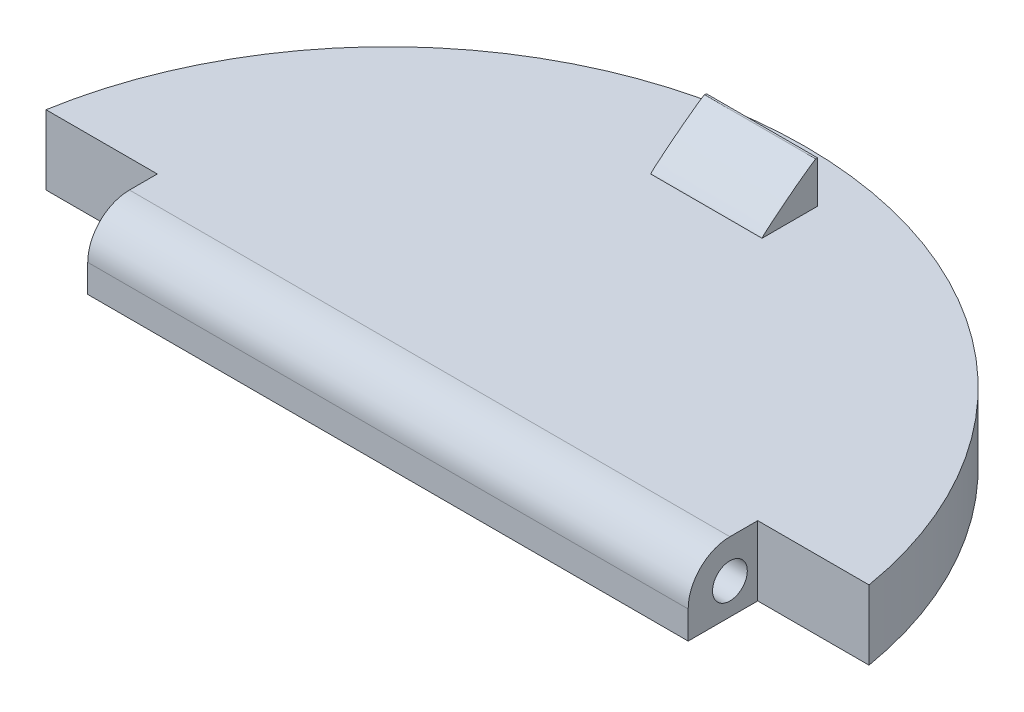
ISO-10303-21;
HEADER;
FILE_DESCRIPTION(('STEP AP214'),'2;1');
FILE_NAME('part.step','',(''),(''),'','','');
FILE_SCHEMA(('AUTOMOTIVE_DESIGN { 1 0 10303 214 1 1 1 1 }'));
ENDSEC;
DATA;
#1=APPLICATION_CONTEXT('core data for automotive mechanical design processes');
#2=APPLICATION_PROTOCOL_DEFINITION('international standard','automotive_design',2000,#1);
#3=PRODUCT_CONTEXT('',#1,'mechanical');
#4=PRODUCT('Part','Part','',(#3));
#5=PRODUCT_RELATED_PRODUCT_CATEGORY('part','',(#4));
#6=PRODUCT_DEFINITION_FORMATION('','',#4);
#7=PRODUCT_DEFINITION_CONTEXT('part definition',#1,'design');
#8=PRODUCT_DEFINITION('design','',#6,#7);
#9=PRODUCT_DEFINITION_SHAPE('','',#8);
#10=(LENGTH_UNIT() NAMED_UNIT(*) SI_UNIT(.MILLI.,.METRE.));
#11=(NAMED_UNIT(*) PLANE_ANGLE_UNIT() SI_UNIT($,.RADIAN.));
#12=(NAMED_UNIT(*) SI_UNIT($,.STERADIAN.) SOLID_ANGLE_UNIT());
#13=UNCERTAINTY_MEASURE_WITH_UNIT(LENGTH_MEASURE(1.E-05),#10,'distance_accuracy_value','');
#14=(GEOMETRIC_REPRESENTATION_CONTEXT(3) GLOBAL_UNCERTAINTY_ASSIGNED_CONTEXT((#13)) GLOBAL_UNIT_ASSIGNED_CONTEXT((#10,
#11,#12)) REPRESENTATION_CONTEXT('',''));
#15=CARTESIAN_POINT('',(0.,0.,0.));
#16=DIRECTION('',(0.,0.,1.));
#17=DIRECTION('',(1.,0.,0.));
#18=AXIS2_PLACEMENT_3D('',#15,#16,#17);
#19=CARTESIAN_POINT('',(0.,5.,0.));
#20=DIRECTION('',(0.,1.,0.));
#21=DIRECTION('',(0.,0.,1.));
#22=AXIS2_PLACEMENT_3D('',#19,#20,#21);
#23=PLANE('',#22);
#24=DIRECTION('',(0.,0.,-1.));
#25=VECTOR('',#24,1.);
#26=CARTESIAN_POINT('',(-21.5803989154981,5.,0.));
#27=LINE('',#26,#25);
#28=CARTESIAN_POINT('',(-21.5803989154981,5.,-3.));
#29=VERTEX_POINT('',#28);
#30=CARTESIAN_POINT('',(-21.5803989154981,5.,-5.));
#31=VERTEX_POINT('',#30);
#32=EDGE_CURVE('E125',#29,#31,#27,.T.);
#33=ORIENTED_EDGE('',*,*,#32,.F.);
#34=DIRECTION('',(1.,0.,0.));
#35=VECTOR('',#34,1.);
#36=CARTESIAN_POINT('',(21.5803989154981,5.,-3.));
#37=LINE('',#36,#35);
#38=CARTESIAN_POINT('',(21.5803989154981,5.,-3.));
#39=VERTEX_POINT('',#38);
#40=EDGE_CURVE('E241',#29,#39,#37,.T.);
#41=ORIENTED_EDGE('',*,*,#40,.T.);
#42=DIRECTION('',(0.,0.,1.));
#43=VECTOR('',#42,1.);
#44=CARTESIAN_POINT('',(21.5803989154981,5.,0.));
#45=LINE('',#44,#43);
#46=CARTESIAN_POINT('',(21.5803989154981,5.,-5.));
#47=VERTEX_POINT('',#46);
#48=EDGE_CURVE('E167',#47,#39,#45,.T.);
#49=ORIENTED_EDGE('',*,*,#48,.F.);
#50=DIRECTION('',(-1.,0.,0.));
#51=VECTOR('',#50,1.);
#52=CARTESIAN_POINT('',(21.5803989154981,5.,-5.));
#53=LINE('',#52,#51);
#54=CARTESIAN_POINT('',(29.5803989154981,5.,-5.));
#55=VERTEX_POINT('',#54);
#56=EDGE_CURVE('E163',#55,#47,#53,.T.);
#57=ORIENTED_EDGE('',*,*,#56,.F.);
#58=CARTESIAN_POINT('',(0.,5.,0.));
#59=DIRECTION('',(0.,1.,0.));
#60=DIRECTION('',(0.,0.,1.));
#61=AXIS2_PLACEMENT_3D('',#58,#59,#60);
#62=CIRCLE('',#61,30.);
#63=CARTESIAN_POINT('',(-29.5803989154981,5.,-5.));
#64=VERTEX_POINT('',#63);
#65=EDGE_CURVE('E153',#55,#64,#62,.T.);
#66=ORIENTED_EDGE('',*,*,#65,.T.);
#67=DIRECTION('',(-1.,0.,0.));
#68=VECTOR('',#67,1.);
#69=CARTESIAN_POINT('',(-21.5803989154981,5.,-5.));
#70=LINE('',#69,#68);
#71=EDGE_CURVE('E136',#31,#64,#70,.T.);
#72=ORIENTED_EDGE('',*,*,#71,.F.);
#73=EDGE_LOOP('',(#33,#41,#49,#57,#66,#72));
#74=FACE_BOUND('',#73,.T.);
#75=DIRECTION('',(-1.,0.,0.));
#76=VECTOR('',#75,1.);
#77=CARTESIAN_POINT('',(-3.84159331598207,5.,-26.7316665793187));
#78=LINE('',#77,#76);
#79=CARTESIAN_POINT('',(4.15840668401793,5.,-26.7316665793187));
#80=VERTEX_POINT('',#79);
#81=CARTESIAN_POINT('',(-3.84159331598207,5.,-26.7316665793187));
#82=VERTEX_POINT('',#81);
#83=EDGE_CURVE('E200',#80,#82,#78,.T.);
#84=ORIENTED_EDGE('',*,*,#83,.F.);
#85=DIRECTION('',(0.,0.,-1.));
#86=VECTOR('',#85,1.);
#87=CARTESIAN_POINT('',(4.15840668401793,5.,-26.7316665793187));
#88=LINE('',#87,#86);
#89=CARTESIAN_POINT('',(4.15840668401793,5.,-22.7316665793187));
#90=VERTEX_POINT('',#89);
#91=EDGE_CURVE('E161',#90,#80,#88,.T.);
#92=ORIENTED_EDGE('',*,*,#91,.F.);
#93=CARTESIAN_POINT('',(-4.24159331598207,5.,-22.7316665793187));
#94=CARTESIAN_POINT('',(-1.30825998264874,5.,-22.7316665793187));
#95=CARTESIAN_POINT('',(1.6250733506846,5.,-22.7316665793187));
#96=CARTESIAN_POINT('',(4.55840668401793,5.,-22.7316665793187));
#97=(BOUNDED_CURVE() B_SPLINE_CURVE(3,(#93,#94,#95,#96),.UNSPECIFIED.,.F.,
.F.) B_SPLINE_CURVE_WITH_KNOTS((4,4),(-0.00455840668401793,0.00424159331598207),
.UNSPECIFIED.) CURVE() GEOMETRIC_REPRESENTATION_ITEM() RATIONAL_B_SPLINE_CURVE((1.,1.,1.,1.)) REPRESENTATION_ITEM(''));
#98=CARTESIAN_POINT('',(-3.84159331598207,5.,-22.7316665793187));
#99=VERTEX_POINT('',#98);
#100=EDGE_CURVE('E188',#99,#90,#97,.T.);
#101=ORIENTED_EDGE('',*,*,#100,.F.);
#102=DIRECTION('',(0.,0.,1.));
#103=VECTOR('',#102,1.);
#104=CARTESIAN_POINT('',(-3.84159331598207,5.,-26.7316665793187));
#105=LINE('',#104,#103);
#106=EDGE_CURVE('E203',#82,#99,#105,.T.);
#107=ORIENTED_EDGE('',*,*,#106,.F.);
#108=EDGE_LOOP('',(#84,#92,#101,#107));
#109=FACE_BOUND('',#108,.T.);
#110=ADVANCED_FACE('F44',(#74,#109),#23,.T.);
#111=CARTESIAN_POINT('',(0.,5.,0.));
#112=DIRECTION('',(0.,-1.,0.));
#113=DIRECTION('',(0.,0.,-1.));
#114=AXIS2_PLACEMENT_3D('',#111,#112,#113);
#115=CYLINDRICAL_SURFACE('',#114,30.);
#116=CARTESIAN_POINT('',(0.,0.,0.));
#117=DIRECTION('',(0.,1.,0.));
#118=DIRECTION('',(0.,0.,1.));
#119=AXIS2_PLACEMENT_3D('',#116,#117,#118);
#120=CIRCLE('',#119,30.);
#121=CARTESIAN_POINT('',(29.5803989154981,0.,-5.));
#122=VERTEX_POINT('',#121);
#123=CARTESIAN_POINT('',(-29.5803989154981,0.,-5.));
#124=VERTEX_POINT('',#123);
#125=EDGE_CURVE('E210',#122,#124,#120,.T.);
#126=ORIENTED_EDGE('',*,*,#125,.T.);
#127=DIRECTION('',(0.,1.,0.));
#128=VECTOR('',#127,1.);
#129=CARTESIAN_POINT('',(-29.5803989154981,-5.,-5.));
#130=LINE('',#129,#128);
#131=EDGE_CURVE('E146',#124,#64,#130,.T.);
#132=ORIENTED_EDGE('',*,*,#131,.T.);
#133=ORIENTED_EDGE('',*,*,#65,.F.);
#134=DIRECTION('',(0.,1.,0.));
#135=VECTOR('',#134,1.);
#136=CARTESIAN_POINT('',(29.5803989154981,-5.,-5.));
#137=LINE('',#136,#135);
#138=EDGE_CURVE('E171',#122,#55,#137,.T.);
#139=ORIENTED_EDGE('',*,*,#138,.F.);
#140=EDGE_LOOP('',(#126,#132,#133,#139));
#141=FACE_BOUND('',#140,.T.);
#142=ADVANCED_FACE('F251',(#141),#115,.T.);
#143=CARTESIAN_POINT('',(-30.,5.,0.));
#144=DIRECTION('',(0.,0.,-1.));
#145=DIRECTION('',(-1.,0.,0.));
#146=AXIS2_PLACEMENT_3D('',#143,#144,#145);
#147=PLANE('',#146);
#148=DIRECTION('',(0.,1.,0.));
#149=VECTOR('',#148,1.);
#150=CARTESIAN_POINT('',(21.5803989154981,-5.,0.));
#151=LINE('',#150,#149);
#152=CARTESIAN_POINT('',(21.5803989154981,0.,0.));
#153=VERTEX_POINT('',#152);
#154=CARTESIAN_POINT('',(21.5803989154981,2.,0.));
#155=VERTEX_POINT('',#154);
#156=EDGE_CURVE('E137',#153,#155,#151,.T.);
#157=ORIENTED_EDGE('',*,*,#156,.T.);
#158=DIRECTION('',(1.,0.,0.));
#159=VECTOR('',#158,1.);
#160=CARTESIAN_POINT('',(-21.5803989154981,2.,0.));
#161=LINE('',#160,#159);
#162=CARTESIAN_POINT('',(-21.5803989154981,2.,0.));
#163=VERTEX_POINT('',#162);
#164=EDGE_CURVE('E52',#155,#163,#161,.F.);
#165=ORIENTED_EDGE('',*,*,#164,.T.);
#166=DIRECTION('',(0.,1.,0.));
#167=VECTOR('',#166,1.);
#168=CARTESIAN_POINT('',(-21.5803989154981,-5.,0.));
#169=LINE('',#168,#167);
#170=CARTESIAN_POINT('',(-21.5803989154981,0.,0.));
#171=VERTEX_POINT('',#170);
#172=EDGE_CURVE('E147',#171,#163,#169,.T.);
#173=ORIENTED_EDGE('',*,*,#172,.F.);
#174=DIRECTION('',(1.,0.,0.));
#175=VECTOR('',#174,1.);
#176=CARTESIAN_POINT('',(-30.,0.,0.));
#177=LINE('',#176,#175);
#178=EDGE_CURVE('E189',#171,#153,#177,.T.);
#179=ORIENTED_EDGE('',*,*,#178,.T.);
#180=EDGE_LOOP('',(#157,#165,#173,#179));
#181=FACE_BOUND('',#180,.T.);
#182=ADVANCED_FACE('F221',(#181),#147,.F.);
#183=CARTESIAN_POINT('',(0.,0.,0.));
#184=DIRECTION('',(0.,1.,0.));
#185=DIRECTION('',(0.,0.,1.));
#186=AXIS2_PLACEMENT_3D('',#183,#184,#185);
#187=PLANE('',#186);
#188=DIRECTION('',(0.,0.,-1.));
#189=VECTOR('',#188,1.);
#190=CARTESIAN_POINT('',(-21.5803989154981,0.,0.));
#191=LINE('',#190,#189);
#192=CARTESIAN_POINT('',(-21.5803989154981,0.,-5.));
#193=VERTEX_POINT('',#192);
#194=EDGE_CURVE('E225',#171,#193,#191,.T.);
#195=ORIENTED_EDGE('',*,*,#194,.T.);
#196=DIRECTION('',(-1.,0.,0.));
#197=VECTOR('',#196,1.);
#198=CARTESIAN_POINT('',(0.,0.,-5.));
#199=LINE('',#198,#197);
#200=EDGE_CURVE('E143',#193,#124,#199,.T.);
#201=ORIENTED_EDGE('',*,*,#200,.T.);
#202=ORIENTED_EDGE('',*,*,#125,.F.);
#203=DIRECTION('',(-1.,0.,0.));
#204=VECTOR('',#203,1.);
#205=CARTESIAN_POINT('',(0.,0.,-5.));
#206=LINE('',#205,#204);
#207=CARTESIAN_POINT('',(21.5803989154981,0.,-5.));
#208=VERTEX_POINT('',#207);
#209=EDGE_CURVE('E229',#122,#208,#206,.T.);
#210=ORIENTED_EDGE('',*,*,#209,.T.);
#211=DIRECTION('',(0.,0.,1.));
#212=VECTOR('',#211,1.);
#213=CARTESIAN_POINT('',(21.5803989154981,0.,0.));
#214=LINE('',#213,#212);
#215=EDGE_CURVE('E228',#208,#153,#214,.T.);
#216=ORIENTED_EDGE('',*,*,#215,.T.);
#217=ORIENTED_EDGE('',*,*,#178,.F.);
#218=EDGE_LOOP('',(#195,#201,#202,#210,#216,#217));
#219=FACE_BOUND('',#218,.T.);
#220=ADVANCED_FACE('F224',(#219),#187,.F.);
#221=CARTESIAN_POINT('',(4.15840668401793,8.,-26.7316665793187));
#222=DIRECTION('',(-1.,0.,0.));
#223=DIRECTION('',(0.,0.,1.));
#224=AXIS2_PLACEMENT_3D('',#221,#222,#223);
#225=PLANE('',#224);
#226=DIRECTION('',(0.,0.,-1.));
#227=VECTOR('',#226,1.);
#228=CARTESIAN_POINT('',(4.15840668401793,8.,-26.7316665793187));
#229=LINE('',#228,#227);
#230=CARTESIAN_POINT('',(4.15840668401793,8.,-26.6046499255261));
#231=VERTEX_POINT('',#230);
#232=CARTESIAN_POINT('',(4.15840668401793,8.,-26.7316665793187));
#233=VERTEX_POINT('',#232);
#234=EDGE_CURVE('E184',#231,#233,#229,.T.);
#235=ORIENTED_EDGE('',*,*,#234,.F.);
#236=CARTESIAN_POINT('',(4.15840668401793,5.,-22.7316665793187));
#237=CARTESIAN_POINT('',(4.15840668401793,8.,-23.5062632485602));
#238=CARTESIAN_POINT('',(4.15840668401793,8.,-26.6046499255261));
#239=(BOUNDED_CURVE() B_SPLINE_CURVE(2,(#236,#237,#238),.UNSPECIFIED.,.F.,
.F.) B_SPLINE_CURVE_WITH_KNOTS((3,3),(0.,1.),
.UNSPECIFIED.) CURVE() GEOMETRIC_REPRESENTATION_ITEM() RATIONAL_B_SPLINE_CURVE((1.,
0.0574959574576069,1.)) REPRESENTATION_ITEM(''));
#240=EDGE_CURVE('E350',#231,#90,#239,.F.);
#241=ORIENTED_EDGE('',*,*,#240,.T.);
#242=ORIENTED_EDGE('',*,*,#91,.T.);
#243=DIRECTION('',(0.,-1.,0.));
#244=VECTOR('',#243,1.);
#245=CARTESIAN_POINT('',(4.15840668401793,8.,-26.7316665793187));
#246=LINE('',#245,#244);
#247=EDGE_CURVE('E207',#233,#80,#246,.T.);
#248=ORIENTED_EDGE('',*,*,#247,.F.);
#249=EDGE_LOOP('',(#235,#241,#242,#248));
#250=FACE_BOUND('',#249,.T.);
#251=ADVANCED_FACE('F333',(#250),#225,.F.);
#252=CARTESIAN_POINT('',(-3.84159331598207,8.,-26.7316665793187));
#253=DIRECTION('',(0.,0.,1.));
#254=DIRECTION('',(1.,0.,0.));
#255=AXIS2_PLACEMENT_3D('',#252,#253,#254);
#256=PLANE('',#255);
#257=ORIENTED_EDGE('',*,*,#83,.T.);
#258=DIRECTION('',(0.,-1.,0.));
#259=VECTOR('',#258,1.);
#260=CARTESIAN_POINT('',(-3.84159331598207,8.,-26.7316665793187));
#261=LINE('',#260,#259);
#262=CARTESIAN_POINT('',(-3.84159331598207,8.,-26.7316665793187));
#263=VERTEX_POINT('',#262);
#264=EDGE_CURVE('E195',#263,#82,#261,.T.);
#265=ORIENTED_EDGE('',*,*,#264,.F.);
#266=DIRECTION('',(-1.,0.,0.));
#267=VECTOR('',#266,1.);
#268=CARTESIAN_POINT('',(-3.84159331598207,8.,-26.7316665793187));
#269=LINE('',#268,#267);
#270=EDGE_CURVE('E181',#233,#263,#269,.T.);
#271=ORIENTED_EDGE('',*,*,#270,.F.);
#272=ORIENTED_EDGE('',*,*,#247,.T.);
#273=EDGE_LOOP('',(#257,#265,#271,#272));
#274=FACE_BOUND('',#273,.T.);
#275=ADVANCED_FACE('F340',(#274),#256,.F.);
#276=CARTESIAN_POINT('',(-3.84159331598207,8.,-26.7316665793187));
#277=DIRECTION('',(1.,0.,0.));
#278=DIRECTION('',(0.,0.,-1.));
#279=AXIS2_PLACEMENT_3D('',#276,#277,#278);
#280=PLANE('',#279);
#281=ORIENTED_EDGE('',*,*,#106,.T.);
#282=CARTESIAN_POINT('',(-3.84159331598207,8.,-26.6046499255261));
#283=CARTESIAN_POINT('',(-3.84159331598207,8.,-23.5062632485602));
#284=CARTESIAN_POINT('',(-3.84159331598207,5.,-22.7316665793187));
#285=(BOUNDED_CURVE() B_SPLINE_CURVE(2,(#282,#283,#284),.UNSPECIFIED.,.F.,
.F.) B_SPLINE_CURVE_WITH_KNOTS((3,3),(0.,1.),
.UNSPECIFIED.) CURVE() GEOMETRIC_REPRESENTATION_ITEM() RATIONAL_B_SPLINE_CURVE((1.,
0.0574959574576069,1.)) REPRESENTATION_ITEM(''));
#286=CARTESIAN_POINT('',(-3.84159331598207,8.,-26.6046499255261));
#287=VERTEX_POINT('',#286);
#288=EDGE_CURVE('E235',#99,#287,#285,.F.);
#289=ORIENTED_EDGE('',*,*,#288,.T.);
#290=DIRECTION('',(0.,0.,1.));
#291=VECTOR('',#290,1.);
#292=CARTESIAN_POINT('',(-3.84159331598207,8.,-26.7316665793187));
#293=LINE('',#292,#291);
#294=EDGE_CURVE('E191',#263,#287,#293,.T.);
#295=ORIENTED_EDGE('',*,*,#294,.F.);
#296=ORIENTED_EDGE('',*,*,#264,.T.);
#297=EDGE_LOOP('',(#281,#289,#295,#296));
#298=FACE_BOUND('',#297,.T.);
#299=ADVANCED_FACE('F345',(#298),#280,.F.);
#300=CARTESIAN_POINT('',(0.,8.,0.));
#301=DIRECTION('',(0.,1.,0.));
#302=DIRECTION('',(0.,0.,1.));
#303=AXIS2_PLACEMENT_3D('',#300,#301,#302);
#304=PLANE('',#303);
#305=ORIENTED_EDGE('',*,*,#294,.T.);
#306=CARTESIAN_POINT('',(4.55840668401793,8.,-26.6046499255261));
#307=CARTESIAN_POINT('',(1.6250733506846,8.,-26.6046499255261));
#308=CARTESIAN_POINT('',(-1.30825998264874,8.,-26.6046499255261));
#309=CARTESIAN_POINT('',(-4.24159331598207,8.,-26.6046499255261));
#310=(BOUNDED_CURVE() B_SPLINE_CURVE(3,(#306,#307,#308,#309),.UNSPECIFIED.,.F.,
.F.) B_SPLINE_CURVE_WITH_KNOTS((4,4),(-0.00455840668401793,0.00424159331598207),
.UNSPECIFIED.) CURVE() GEOMETRIC_REPRESENTATION_ITEM() RATIONAL_B_SPLINE_CURVE((1.,1.,1.,1.)) REPRESENTATION_ITEM(''));
#311=EDGE_CURVE('E212',#287,#231,#310,.F.);
#312=ORIENTED_EDGE('',*,*,#311,.T.);
#313=ORIENTED_EDGE('',*,*,#234,.T.);
#314=ORIENTED_EDGE('',*,*,#270,.T.);
#315=EDGE_LOOP('',(#305,#312,#313,#314));
#316=FACE_BOUND('',#315,.T.);
#317=ADVANCED_FACE('F271',(#316),#304,.T.);
#318=CARTESIAN_POINT('',(4.55840668401793,5.,-22.7316665793187));
#319=CARTESIAN_POINT('',(1.6250733506846,5.,-22.7316665793187));
#320=CARTESIAN_POINT('',(-1.30825998264874,5.,-22.7316665793187));
#321=CARTESIAN_POINT('',(-4.24159331598207,5.,-22.7316665793187));
#322=CARTESIAN_POINT('',(4.55840668401793,8.,-23.5062632485602));
#323=CARTESIAN_POINT('',(1.6250733506846,8.,-23.5062632485602));
#324=CARTESIAN_POINT('',(-1.30825998264874,8.,-23.5062632485602));
#325=CARTESIAN_POINT('',(-4.24159331598207,8.,-23.5062632485602));
#326=CARTESIAN_POINT('',(4.55840668401793,8.,-26.6046499255261));
#327=CARTESIAN_POINT('',(1.6250733506846,8.,-26.6046499255261));
#328=CARTESIAN_POINT('',(-1.30825998264874,8.,-26.6046499255261));
#329=CARTESIAN_POINT('',(-4.24159331598207,8.,-26.6046499255261));
#330=(BOUNDED_SURFACE() B_SPLINE_SURFACE(2,3,((#318,#319,#320,#321),(#322,#323,#324,#325),(#326,
#327,#328,#329)),.UNSPECIFIED.,.F.,.F.,.F.) B_SPLINE_SURFACE_WITH_KNOTS((3,3),(4,4),(0.,1.),
(-0.00455840668401793,0.00424159331598207),
.UNSPECIFIED.) GEOMETRIC_REPRESENTATION_ITEM() RATIONAL_B_SPLINE_SURFACE(((1.,1.,1.,1.),
(0.0574959574576069,0.0574959574576069,0.0574959574576069,0.0574959574576069),(1.,1.,1.,1.))) REPRESENTATION_ITEM('') SURFACE());
#331=ORIENTED_EDGE('',*,*,#288,.F.);
#332=ORIENTED_EDGE('',*,*,#100,.T.);
#333=ORIENTED_EDGE('',*,*,#240,.F.);
#334=ORIENTED_EDGE('',*,*,#311,.F.);
#335=EDGE_LOOP('',(#331,#332,#333,#334));
#336=FACE_BOUND('',#335,.T.);
#337=ADVANCED_FACE('F264',(#336),#330,.T.);
#338=CARTESIAN_POINT('',(21.5803989154981,-5.,0.));
#339=DIRECTION('',(-1.,0.,0.));
#340=DIRECTION('',(0.,0.,1.));
#341=AXIS2_PLACEMENT_3D('',#338,#339,#340);
#342=PLANE('',#341);
#343=CARTESIAN_POINT('',(21.5803989154981,2.25,-3.));
#344=DIRECTION('',(1.,0.,0.));
#345=DIRECTION('',(0.,0.,-1.));
#346=AXIS2_PLACEMENT_3D('',#343,#344,#345);
#347=CIRCLE('',#346,1.25);
#348=CARTESIAN_POINT('',(21.5803989154981,2.25,-4.25));
#349=VERTEX_POINT('',#348);
#350=EDGE_CURVE('E425',#349,#349,#347,.T.);
#351=ORIENTED_EDGE('',*,*,#350,.F.);
#352=EDGE_LOOP('',(#351));
#353=FACE_BOUND('',#352,.T.);
#354=ORIENTED_EDGE('',*,*,#48,.T.);
#355=CARTESIAN_POINT('',(21.5803989154981,2.,-3.));
#356=DIRECTION('',(-1.,0.,0.));
#357=DIRECTION('',(0.,0.,1.));
#358=AXIS2_PLACEMENT_3D('',#355,#356,#357);
#359=CIRCLE('',#358,3.);
#360=EDGE_CURVE('E66',#39,#155,#359,.F.);
#361=ORIENTED_EDGE('',*,*,#360,.T.);
#362=ORIENTED_EDGE('',*,*,#156,.F.);
#363=ORIENTED_EDGE('',*,*,#215,.F.);
#364=DIRECTION('',(0.,1.,0.));
#365=VECTOR('',#364,1.);
#366=CARTESIAN_POINT('',(21.5803989154981,-5.,-5.));
#367=LINE('',#366,#365);
#368=EDGE_CURVE('E174',#208,#47,#367,.T.);
#369=ORIENTED_EDGE('',*,*,#368,.T.);
#370=EDGE_LOOP('',(#354,#361,#362,#363,#369));
#371=FACE_BOUND('',#370,.T.);
#372=ADVANCED_FACE('F248',(#353,#371),#342,.F.);
#373=CARTESIAN_POINT('',(21.5803989154981,-5.,-5.));
#374=DIRECTION('',(0.,0.,-1.));
#375=DIRECTION('',(-1.,0.,0.));
#376=AXIS2_PLACEMENT_3D('',#373,#374,#375);
#377=PLANE('',#376);
#378=ORIENTED_EDGE('',*,*,#138,.T.);
#379=ORIENTED_EDGE('',*,*,#56,.T.);
#380=ORIENTED_EDGE('',*,*,#368,.F.);
#381=ORIENTED_EDGE('',*,*,#209,.F.);
#382=EDGE_LOOP('',(#378,#379,#380,#381));
#383=FACE_BOUND('',#382,.T.);
#384=ADVANCED_FACE('F250',(#383),#377,.F.);
#385=CARTESIAN_POINT('',(-21.5803989154981,-5.,-5.));
#386=DIRECTION('',(0.,0.,-1.));
#387=DIRECTION('',(-1.,0.,0.));
#388=AXIS2_PLACEMENT_3D('',#385,#386,#387);
#389=PLANE('',#388);
#390=DIRECTION('',(0.,1.,0.));
#391=VECTOR('',#390,1.);
#392=CARTESIAN_POINT('',(-21.5803989154981,-5.,-5.));
#393=LINE('',#392,#391);
#394=EDGE_CURVE('E128',#193,#31,#393,.T.);
#395=ORIENTED_EDGE('',*,*,#394,.T.);
#396=ORIENTED_EDGE('',*,*,#71,.T.);
#397=ORIENTED_EDGE('',*,*,#131,.F.);
#398=ORIENTED_EDGE('',*,*,#200,.F.);
#399=EDGE_LOOP('',(#395,#396,#397,#398));
#400=FACE_BOUND('',#399,.T.);
#401=ADVANCED_FACE('F140',(#400),#389,.F.);
#402=CARTESIAN_POINT('',(-21.5803989154981,-5.,0.));
#403=DIRECTION('',(1.,0.,0.));
#404=DIRECTION('',(0.,0.,-1.));
#405=AXIS2_PLACEMENT_3D('',#402,#403,#404);
#406=PLANE('',#405);
#407=CARTESIAN_POINT('',(-21.5803989154981,2.25,-3.));
#408=DIRECTION('',(-1.,0.,0.));
#409=DIRECTION('',(0.,0.,1.));
#410=AXIS2_PLACEMENT_3D('',#407,#408,#409);
#411=CIRCLE('',#410,1.25);
#412=CARTESIAN_POINT('',(-21.5803989154981,2.25,-1.75));
#413=VERTEX_POINT('',#412);
#414=EDGE_CURVE('E426',#413,#413,#411,.T.);
#415=ORIENTED_EDGE('',*,*,#414,.F.);
#416=EDGE_LOOP('',(#415));
#417=FACE_BOUND('',#416,.T.);
#418=ORIENTED_EDGE('',*,*,#172,.T.);
#419=CARTESIAN_POINT('',(-21.5803989154981,2.,-3.));
#420=DIRECTION('',(1.,0.,0.));
#421=DIRECTION('',(0.,0.,-1.));
#422=AXIS2_PLACEMENT_3D('',#419,#420,#421);
#423=CIRCLE('',#422,3.);
#424=EDGE_CURVE('E12',#163,#29,#423,.F.);
#425=ORIENTED_EDGE('',*,*,#424,.T.);
#426=ORIENTED_EDGE('',*,*,#32,.T.);
#427=ORIENTED_EDGE('',*,*,#394,.F.);
#428=ORIENTED_EDGE('',*,*,#194,.F.);
#429=EDGE_LOOP('',(#418,#425,#426,#427,#428));
#430=FACE_BOUND('',#429,.T.);
#431=ADVANCED_FACE('F127',(#417,#430),#406,.F.);
#432=CARTESIAN_POINT('',(0.,2.,-3.));
#433=DIRECTION('',(-1.,0.,0.));
#434=DIRECTION('',(0.,0.,1.));
#435=AXIS2_PLACEMENT_3D('',#432,#433,#434);
#436=CYLINDRICAL_SURFACE('',#435,3.);
#437=ORIENTED_EDGE('',*,*,#424,.F.);
#438=ORIENTED_EDGE('',*,*,#164,.F.);
#439=ORIENTED_EDGE('',*,*,#360,.F.);
#440=ORIENTED_EDGE('',*,*,#40,.F.);
#441=EDGE_LOOP('',(#437,#438,#439,#440));
#442=FACE_BOUND('',#441,.T.);
#443=ADVANCED_FACE('F46',(#442),#436,.T.);
#444=CARTESIAN_POINT('',(16.5803989154981,2.25,-3.));
#445=DIRECTION('',(1.,0.,0.));
#446=DIRECTION('',(0.,0.,-1.));
#447=AXIS2_PLACEMENT_3D('',#444,#445,#446);
#448=CYLINDRICAL_SURFACE('',#447,1.25);
#449=CARTESIAN_POINT('',(16.5803989154981,2.25,-3.));
#450=DIRECTION('',(1.,0.,0.));
#451=DIRECTION('',(0.,0.,-1.));
#452=AXIS2_PLACEMENT_3D('',#449,#450,#451);
#453=CIRCLE('',#452,1.25);
#454=CARTESIAN_POINT('',(16.5803989154981,2.25,-4.25));
#455=VERTEX_POINT('',#454);
#456=EDGE_CURVE('E168',#455,#455,#453,.T.);
#457=ORIENTED_EDGE('',*,*,#456,.F.);
#458=EDGE_LOOP('',(#457));
#459=FACE_BOUND('',#458,.T.);
#460=ORIENTED_EDGE('',*,*,#350,.T.);
#461=EDGE_LOOP('',(#460));
#462=FACE_BOUND('',#461,.T.);
#463=ADVANCED_FACE('F404',(#459,#462),#448,.F.);
#464=CARTESIAN_POINT('',(16.5803989154981,2.25,-3.));
#465=DIRECTION('',(1.,0.,0.));
#466=DIRECTION('',(0.,0.,-1.));
#467=AXIS2_PLACEMENT_3D('',#464,#465,#466);
#468=PLANE('',#467);
#469=ORIENTED_EDGE('',*,*,#456,.T.);
#470=EDGE_LOOP('',(#469));
#471=FACE_BOUND('',#470,.T.);
#472=ADVANCED_FACE('F407',(#471),#468,.T.);
#473=CARTESIAN_POINT('',(-16.5803989154981,2.25,-3.));
#474=DIRECTION('',(-1.,0.,0.));
#475=DIRECTION('',(0.,0.,1.));
#476=AXIS2_PLACEMENT_3D('',#473,#474,#475);
#477=CYLINDRICAL_SURFACE('',#476,1.25);
#478=CARTESIAN_POINT('',(-16.5803989154981,2.25,-3.));
#479=DIRECTION('',(-1.,0.,0.));
#480=DIRECTION('',(0.,0.,1.));
#481=AXIS2_PLACEMENT_3D('',#478,#479,#480);
#482=CIRCLE('',#481,1.25);
#483=CARTESIAN_POINT('',(-16.5803989154981,2.25,-1.75));
#484=VERTEX_POINT('',#483);
#485=EDGE_CURVE('E423',#484,#484,#482,.T.);
#486=ORIENTED_EDGE('',*,*,#485,.F.);
#487=EDGE_LOOP('',(#486));
#488=FACE_BOUND('',#487,.T.);
#489=ORIENTED_EDGE('',*,*,#414,.T.);
#490=EDGE_LOOP('',(#489));
#491=FACE_BOUND('',#490,.T.);
#492=ADVANCED_FACE('F411',(#488,#491),#477,.F.);
#493=CARTESIAN_POINT('',(-16.5803989154981,2.25,-3.));
#494=DIRECTION('',(-1.,0.,0.));
#495=DIRECTION('',(0.,0.,1.));
#496=AXIS2_PLACEMENT_3D('',#493,#494,#495);
#497=PLANE('',#496);
#498=ORIENTED_EDGE('',*,*,#485,.T.);
#499=EDGE_LOOP('',(#498));
#500=FACE_BOUND('',#499,.T.);
#501=ADVANCED_FACE('F415',(#500),#497,.T.);
#502=CLOSED_SHELL('',(#110,#142,#182,#220,#251,#275,#299,#317,#337,#372,#384,#401,#431,#443,
#463,#472,#492,#501));
#503=MANIFOLD_SOLID_BREP('B2',#502);
#504=ADVANCED_BREP_SHAPE_REPRESENTATION('',(#18,#503),#14);
#505=SHAPE_DEFINITION_REPRESENTATION(#9,#504);
ENDSEC;
END-ISO-10303-21;
